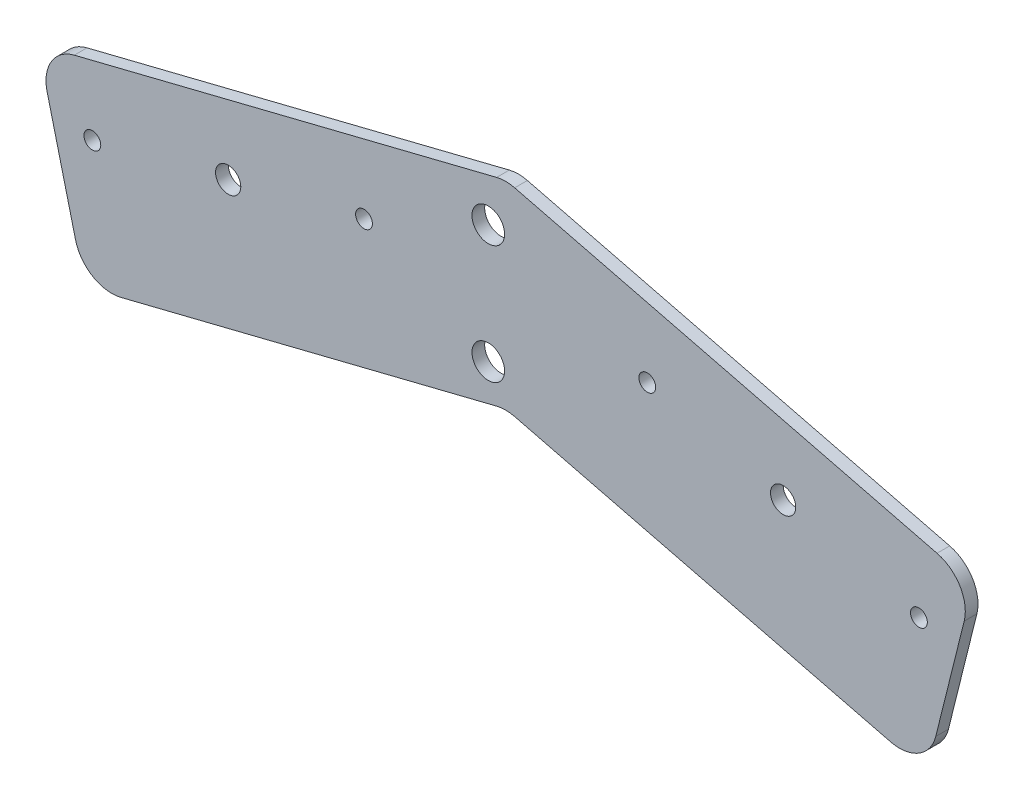
ISO-10303-21;
HEADER;
FILE_DESCRIPTION(('STEP AP214'),'2;1');
FILE_NAME('part.step','',(''),(''),'','','');
FILE_SCHEMA(('AUTOMOTIVE_DESIGN { 1 0 10303 214 1 1 1 1 }'));
ENDSEC;
DATA;
#1=APPLICATION_CONTEXT('core data for automotive mechanical design processes');
#2=APPLICATION_PROTOCOL_DEFINITION('international standard','automotive_design',2000,#1);
#3=PRODUCT_CONTEXT('',#1,'mechanical');
#4=PRODUCT('Part','Part','',(#3));
#5=PRODUCT_RELATED_PRODUCT_CATEGORY('part','',(#4));
#6=PRODUCT_DEFINITION_FORMATION('','',#4);
#7=PRODUCT_DEFINITION_CONTEXT('part definition',#1,'design');
#8=PRODUCT_DEFINITION('design','',#6,#7);
#9=PRODUCT_DEFINITION_SHAPE('','',#8);
#10=(LENGTH_UNIT() NAMED_UNIT(*) SI_UNIT(.MILLI.,.METRE.));
#11=(NAMED_UNIT(*) PLANE_ANGLE_UNIT() SI_UNIT($,.RADIAN.));
#12=(NAMED_UNIT(*) SI_UNIT($,.STERADIAN.) SOLID_ANGLE_UNIT());
#13=UNCERTAINTY_MEASURE_WITH_UNIT(LENGTH_MEASURE(1.E-05),#10,'distance_accuracy_value','');
#14=(GEOMETRIC_REPRESENTATION_CONTEXT(3) GLOBAL_UNCERTAINTY_ASSIGNED_CONTEXT((#13)) GLOBAL_UNIT_ASSIGNED_CONTEXT((#10,
#11,#12)) REPRESENTATION_CONTEXT('',''));
#15=CARTESIAN_POINT('',(0.,0.,0.));
#16=DIRECTION('',(0.,0.,1.));
#17=DIRECTION('',(1.,0.,0.));
#18=AXIS2_PLACEMENT_3D('',#15,#16,#17);
#19=CARTESIAN_POINT('',(0.,-26.5383009557598,-3.4036));
#20=DIRECTION('',(0.,0.,-1.));
#21=DIRECTION('',(-1.,0.,0.));
#22=AXIS2_PLACEMENT_3D('',#19,#20,#21);
#23=PLANE('',#22);
#24=CARTESIAN_POINT('',(-4.64819999999999,-60.7015602345622,-3.4036));
#25=DIRECTION('',(0.,0.,1.));
#26=DIRECTION('',(1.,0.,0.));
#27=AXIS2_PLACEMENT_3D('',#24,#25,#26);
#28=CIRCLE('',#27,4.3688);
#29=CARTESIAN_POINT('',(-0.279399999999996,-60.7015602345622,-3.4036));
#30=VERTEX_POINT('',#29);
#31=EDGE_CURVE('E484',#30,#30,#28,.T.);
#32=ORIENTED_EDGE('',*,*,#31,.T.);
#33=EDGE_LOOP('',(#32));
#34=FACE_BOUND('',#33,.T.);
#35=CARTESIAN_POINT('',(-4.6482,-28.9515602345621,-3.4036));
#36=DIRECTION('',(0.,0.,1.));
#37=DIRECTION('',(1.,0.,0.));
#38=AXIS2_PLACEMENT_3D('',#35,#36,#37);
#39=CIRCLE('',#38,4.3688);
#40=CARTESIAN_POINT('',(-0.279400000000001,-28.9515602345621,-3.4036));
#41=VERTEX_POINT('',#40);
#42=EDGE_CURVE('E492',#41,#41,#39,.T.);
#43=ORIENTED_EDGE('',*,*,#42,.T.);
#44=EDGE_LOOP('',(#43));
#45=FACE_BOUND('',#44,.T.);
#46=CARTESIAN_POINT('',(-110.721225758861,-62.3891120813645,-3.4036));
#47=DIRECTION('',(0.,0.,1.));
#48=DIRECTION('',(1.,0.,0.));
#49=AXIS2_PLACEMENT_3D('',#46,#47,#48);
#50=CIRCLE('',#49,2.25);
#51=CARTESIAN_POINT('',(-108.471225758861,-62.3891120813645,-3.4036));
#52=VERTEX_POINT('',#51);
#53=EDGE_CURVE('E498',#52,#52,#50,.T.);
#54=ORIENTED_EDGE('',*,*,#53,.T.);
#55=EDGE_LOOP('',(#54));
#56=FACE_BOUND('',#55,.T.);
#57=CARTESIAN_POINT('',(-37.9490462881614,-44.2449699113896,-3.4036));
#58=DIRECTION('',(0.,0.,1.));
#59=DIRECTION('',(1.,0.,0.));
#60=AXIS2_PLACEMENT_3D('',#57,#58,#59);
#61=CIRCLE('',#60,2.25);
#62=CARTESIAN_POINT('',(-35.6990462881614,-44.2449699113896,-3.4036));
#63=VERTEX_POINT('',#62);
#64=EDGE_CURVE('E504',#63,#63,#61,.T.);
#65=ORIENTED_EDGE('',*,*,#64,.T.);
#66=EDGE_LOOP('',(#65));
#67=FACE_BOUND('',#66,.T.);
#68=CARTESIAN_POINT('',(37.9490462881613,-44.2449699113896,-3.4036));
#69=DIRECTION('',(0.,0.,1.));
#70=DIRECTION('',(1.,0.,0.));
#71=AXIS2_PLACEMENT_3D('',#68,#69,#70);
#72=CIRCLE('',#71,2.25);
#73=CARTESIAN_POINT('',(40.1990462881613,-44.2449699113896,-3.4036));
#74=VERTEX_POINT('',#73);
#75=EDGE_CURVE('E510',#74,#74,#72,.T.);
#76=ORIENTED_EDGE('',*,*,#75,.T.);
#77=EDGE_LOOP('',(#76));
#78=FACE_BOUND('',#77,.T.);
#79=CARTESIAN_POINT('',(110.721225758861,-62.3891120813644,-3.4036));
#80=DIRECTION('',(0.,0.,1.));
#81=DIRECTION('',(1.,0.,0.));
#82=AXIS2_PLACEMENT_3D('',#79,#80,#81);
#83=CIRCLE('',#82,2.25);
#84=CARTESIAN_POINT('',(112.971225758861,-62.3891120813644,-3.4036));
#85=VERTEX_POINT('',#84);
#86=EDGE_CURVE('E516',#85,#85,#83,.T.);
#87=ORIENTED_EDGE('',*,*,#86,.T.);
#88=EDGE_LOOP('',(#87));
#89=FACE_BOUND('',#88,.T.);
#90=CARTESIAN_POINT('',(-74.3351360235113,-53.317040996377,-3.4036));
#91=DIRECTION('',(0.,0.,1.));
#92=DIRECTION('',(1.,0.,0.));
#93=AXIS2_PLACEMENT_3D('',#90,#91,#92);
#94=CIRCLE('',#93,3.3782);
#95=CARTESIAN_POINT('',(-70.9569360235113,-53.317040996377,-3.4036));
#96=VERTEX_POINT('',#95);
#97=EDGE_CURVE('E305',#96,#96,#94,.T.);
#98=ORIENTED_EDGE('',*,*,#97,.T.);
#99=EDGE_LOOP('',(#98));
#100=FACE_BOUND('',#99,.T.);
#101=CARTESIAN_POINT('',(0.,-26.5383009557598,-3.4036));
#102=DIRECTION('',(0.,0.,1.));
#103=DIRECTION('',(-1.,0.,0.));
#104=AXIS2_PLACEMENT_3D('',#101,#102,#103);
#105=CIRCLE('',#104,10.);
#106=CARTESIAN_POINT('',(2.41921895599665,-16.8353436929998,-3.4036));
#107=VERTEX_POINT('',#106);
#108=CARTESIAN_POINT('',(-2.41921895599665,-16.8353436929998,-3.4036));
#109=VERTEX_POINT('',#108);
#110=EDGE_CURVE('E214',#107,#109,#105,.T.);
#111=ORIENTED_EDGE('',*,*,#110,.F.);
#112=DIRECTION('',(-0.970295726275997,0.241921895599665,0.));
#113=VECTOR('',#112,1.);
#114=CARTESIAN_POINT('',(2.41921895599665,-16.8353436929998,-3.4036));
#115=LINE('',#114,#113);
#116=CARTESIAN_POINT('',(115.560967742793,-45.0447499561963,-3.4036));
#117=VERTEX_POINT('',#116);
#118=EDGE_CURVE('E155',#117,#107,#115,.T.);
#119=ORIENTED_EDGE('',*,*,#118,.F.);
#120=CARTESIAN_POINT('',(113.141748786796,-54.7477072189563,-3.4036));
#121=DIRECTION('',(0.,0.,1.));
#122=DIRECTION('',(-1.,0.,0.));
#123=AXIS2_PLACEMENT_3D('',#120,#121,#122);
#124=CIRCLE('',#123,10.);
#125=CARTESIAN_POINT('',(122.844706049556,-57.1669261749529,-3.4036));
#126=VERTEX_POINT('',#125);
#127=EDGE_CURVE('E139',#126,#117,#124,.T.);
#128=ORIENTED_EDGE('',*,*,#127,.F.);
#129=DIRECTION('',(0.241921895599664,0.970295726275997,0.));
#130=VECTOR('',#129,1.);
#131=CARTESIAN_POINT('',(122.844706049556,-57.1669261749529,-3.4036));
#132=LINE('',#131,#130);
#133=CARTESIAN_POINT('',(115.224166338167,-87.7312415526469,-3.4036));
#134=VERTEX_POINT('',#133);
#135=EDGE_CURVE('E153',#134,#126,#132,.T.);
#136=ORIENTED_EDGE('',*,*,#135,.F.);
#137=CARTESIAN_POINT('',(105.521209075407,-85.3120225966502,-3.4036));
#138=DIRECTION('',(0.,0.,1.));
#139=DIRECTION('',(-1.,0.,0.));
#140=AXIS2_PLACEMENT_3D('',#137,#138,#139);
#141=CIRCLE('',#140,10.);
#142=CARTESIAN_POINT('',(103.10199011941,-95.0149798594102,-3.4036));
#143=VERTEX_POINT('',#142);
#144=EDGE_CURVE('E160',#143,#134,#141,.T.);
#145=ORIENTED_EDGE('',*,*,#144,.F.);
#146=DIRECTION('',(0.970295726275997,-0.241921895599665,0.));
#147=VECTOR('',#146,1.);
#148=CARTESIAN_POINT('',(103.10199011941,-95.0149798594102,-3.4036));
#149=LINE('',#148,#147);
#150=CARTESIAN_POINT('',(2.41921895599663,-69.9119456045196,-3.4036));
#151=VERTEX_POINT('',#150);
#152=EDGE_CURVE('E163',#151,#143,#149,.T.);
#153=ORIENTED_EDGE('',*,*,#152,.F.);
#154=CARTESIAN_POINT('',(0.,-79.6149028672795,-3.4036));
#155=DIRECTION('',(0.,0.,-1.));
#156=DIRECTION('',(1.,0.,0.));
#157=AXIS2_PLACEMENT_3D('',#154,#155,#156);
#158=CIRCLE('',#157,10.);
#159=CARTESIAN_POINT('',(-2.41921895599666,-69.9119456045196,-3.4036));
#160=VERTEX_POINT('',#159);
#161=EDGE_CURVE('E336',#160,#151,#158,.T.);
#162=ORIENTED_EDGE('',*,*,#161,.F.);
#163=DIRECTION('',(0.970295726275997,0.241921895599665,0.));
#164=VECTOR('',#163,1.);
#165=CARTESIAN_POINT('',(-2.41921895599666,-69.9119456045196,-3.4036));
#166=LINE('',#165,#164);
#167=CARTESIAN_POINT('',(-103.10199011941,-95.0149798594102,-3.4036));
#168=VERTEX_POINT('',#167);
#169=EDGE_CURVE('E332',#168,#160,#166,.T.);
#170=ORIENTED_EDGE('',*,*,#169,.F.);
#171=CARTESIAN_POINT('',(-105.521209075407,-85.3120225966503,-3.4036));
#172=DIRECTION('',(0.,0.,1.));
#173=DIRECTION('',(-1.,0.,0.));
#174=AXIS2_PLACEMENT_3D('',#171,#172,#173);
#175=CIRCLE('',#174,9.99999999999999);
#176=CARTESIAN_POINT('',(-115.224166338167,-87.7312415526469,-3.4036));
#177=VERTEX_POINT('',#176);
#178=EDGE_CURVE('E328',#177,#168,#175,.T.);
#179=ORIENTED_EDGE('',*,*,#178,.F.);
#180=DIRECTION('',(0.241921895599665,-0.970295726275997,0.));
#181=VECTOR('',#180,1.);
#182=CARTESIAN_POINT('',(-115.224166338167,-87.7312415526469,-3.4036));
#183=LINE('',#182,#181);
#184=CARTESIAN_POINT('',(-122.844706049556,-57.166926174953,-3.4036));
#185=VERTEX_POINT('',#184);
#186=EDGE_CURVE('E324',#185,#177,#183,.T.);
#187=ORIENTED_EDGE('',*,*,#186,.F.);
#188=CARTESIAN_POINT('',(-113.141748786797,-54.7477072189564,-3.4036));
#189=DIRECTION('',(0.,0.,1.));
#190=DIRECTION('',(1.,0.,0.));
#191=AXIS2_PLACEMENT_3D('',#188,#189,#190);
#192=CIRCLE('',#191,10.);
#193=CARTESIAN_POINT('',(-115.560967742793,-45.0447499561964,-3.4036));
#194=VERTEX_POINT('',#193);
#195=EDGE_CURVE('E320',#194,#185,#192,.T.);
#196=ORIENTED_EDGE('',*,*,#195,.F.);
#197=DIRECTION('',(-0.970295726275997,-0.241921895599665,0.));
#198=VECTOR('',#197,1.);
#199=CARTESIAN_POINT('',(-115.560967742793,-45.0447499561964,-3.4036));
#200=LINE('',#199,#198);
#201=EDGE_CURVE('E317',#109,#194,#200,.T.);
#202=ORIENTED_EDGE('',*,*,#201,.F.);
#203=EDGE_LOOP('',(#111,#119,#128,#136,#145,#153,#162,#170,#179,#187,#196,#202));
#204=FACE_BOUND('',#203,.T.);
#205=CARTESIAN_POINT('',(74.3351360235112,-53.317040996377,-3.4036));
#206=DIRECTION('',(0.,0.,1.));
#207=DIRECTION('',(1.,0.,0.));
#208=AXIS2_PLACEMENT_3D('',#205,#206,#207);
#209=CIRCLE('',#208,3.3782);
#210=CARTESIAN_POINT('',(77.7133360235112,-53.317040996377,-3.4036));
#211=VERTEX_POINT('',#210);
#212=EDGE_CURVE('E174',#211,#211,#209,.T.);
#213=ORIENTED_EDGE('',*,*,#212,.T.);
#214=EDGE_LOOP('',(#213));
#215=FACE_BOUND('',#214,.T.);
#216=ADVANCED_FACE('F41',(#34,#45,#56,#67,#78,#89,#100,#204,#215),#23,.T.);
#217=CARTESIAN_POINT('',(0.,-26.5383009557598,-3.4036));
#218=DIRECTION('',(0.,0.,1.));
#219=DIRECTION('',(1.,0.,0.));
#220=AXIS2_PLACEMENT_3D('',#217,#218,#219);
#221=CYLINDRICAL_SURFACE('',#220,10.);
#222=CARTESIAN_POINT('',(0.,-26.5383009557598,0.));
#223=DIRECTION('',(0.,0.,1.));
#224=DIRECTION('',(-1.,0.,0.));
#225=AXIS2_PLACEMENT_3D('',#222,#223,#224);
#226=CIRCLE('',#225,10.);
#227=CARTESIAN_POINT('',(2.41921895599665,-16.8353436929998,0.));
#228=VERTEX_POINT('',#227);
#229=CARTESIAN_POINT('',(-2.41921895599665,-16.8353436929998,0.));
#230=VERTEX_POINT('',#229);
#231=EDGE_CURVE('E169',#228,#230,#226,.T.);
#232=ORIENTED_EDGE('',*,*,#231,.F.);
#233=DIRECTION('',(0.,0.,1.));
#234=VECTOR('',#233,1.);
#235=CARTESIAN_POINT('',(2.41921895599665,-16.8353436929998,-3.4036));
#236=LINE('',#235,#234);
#237=EDGE_CURVE('E11',#107,#228,#236,.T.);
#238=ORIENTED_EDGE('',*,*,#237,.F.);
#239=ORIENTED_EDGE('',*,*,#110,.T.);
#240=DIRECTION('',(0.,0.,1.));
#241=VECTOR('',#240,1.);
#242=CARTESIAN_POINT('',(-2.41921895599665,-16.8353436929998,-3.4036));
#243=LINE('',#242,#241);
#244=EDGE_CURVE('E45',#109,#230,#243,.T.);
#245=ORIENTED_EDGE('',*,*,#244,.T.);
#246=EDGE_LOOP('',(#232,#238,#239,#245));
#247=FACE_BOUND('',#246,.T.);
#248=ADVANCED_FACE('F43',(#247),#221,.T.);
#249=CARTESIAN_POINT('',(2.41921895599665,-16.8353436929998,-3.4036));
#250=DIRECTION('',(0.241921895599665,0.970295726275997,0.));
#251=DIRECTION('',(-0.970295726275997,0.241921895599665,0.));
#252=AXIS2_PLACEMENT_3D('',#249,#250,#251);
#253=PLANE('',#252);
#254=DIRECTION('',(-0.970295726275997,0.241921895599665,0.));
#255=VECTOR('',#254,1.);
#256=CARTESIAN_POINT('',(2.41921895599665,-16.8353436929998,0.));
#257=LINE('',#256,#255);
#258=CARTESIAN_POINT('',(115.560967742793,-45.0447499561963,0.));
#259=VERTEX_POINT('',#258);
#260=EDGE_CURVE('E211',#259,#228,#257,.T.);
#261=ORIENTED_EDGE('',*,*,#260,.F.);
#262=DIRECTION('',(0.,0.,1.));
#263=VECTOR('',#262,1.);
#264=CARTESIAN_POINT('',(115.560967742793,-45.0447499561963,-3.4036));
#265=LINE('',#264,#263);
#266=EDGE_CURVE('E52',#117,#259,#265,.T.);
#267=ORIENTED_EDGE('',*,*,#266,.F.);
#268=ORIENTED_EDGE('',*,*,#118,.T.);
#269=ORIENTED_EDGE('',*,*,#237,.T.);
#270=EDGE_LOOP('',(#261,#267,#268,#269));
#271=FACE_BOUND('',#270,.T.);
#272=ADVANCED_FACE('F244',(#271),#253,.T.);
#273=CARTESIAN_POINT('',(113.141748786796,-54.7477072189563,-3.4036));
#274=DIRECTION('',(0.,0.,1.));
#275=DIRECTION('',(1.,0.,0.));
#276=AXIS2_PLACEMENT_3D('',#273,#274,#275);
#277=CYLINDRICAL_SURFACE('',#276,10.);
#278=CARTESIAN_POINT('',(113.141748786796,-54.7477072189563,0.));
#279=DIRECTION('',(0.,0.,1.));
#280=DIRECTION('',(-1.,0.,0.));
#281=AXIS2_PLACEMENT_3D('',#278,#279,#280);
#282=CIRCLE('',#281,10.);
#283=CARTESIAN_POINT('',(122.844706049556,-57.1669261749529,0.));
#284=VERTEX_POINT('',#283);
#285=EDGE_CURVE('E141',#284,#259,#282,.T.);
#286=ORIENTED_EDGE('',*,*,#285,.F.);
#287=DIRECTION('',(0.,0.,1.));
#288=VECTOR('',#287,1.);
#289=CARTESIAN_POINT('',(122.844706049556,-57.1669261749529,-3.4036));
#290=LINE('',#289,#288);
#291=EDGE_CURVE('E136',#126,#284,#290,.T.);
#292=ORIENTED_EDGE('',*,*,#291,.F.);
#293=ORIENTED_EDGE('',*,*,#127,.T.);
#294=ORIENTED_EDGE('',*,*,#266,.T.);
#295=EDGE_LOOP('',(#286,#292,#293,#294));
#296=FACE_BOUND('',#295,.T.);
#297=ADVANCED_FACE('F138',(#296),#277,.T.);
#298=CARTESIAN_POINT('',(122.844706049556,-57.1669261749529,-3.4036));
#299=DIRECTION('',(0.970295726275997,-0.241921895599664,0.));
#300=DIRECTION('',(0.241921895599664,0.970295726275997,0.));
#301=AXIS2_PLACEMENT_3D('',#298,#299,#300);
#302=PLANE('',#301);
#303=DIRECTION('',(0.241921895599664,0.970295726275997,0.));
#304=VECTOR('',#303,1.);
#305=CARTESIAN_POINT('',(122.844706049556,-57.1669261749529,0.));
#306=LINE('',#305,#304);
#307=CARTESIAN_POINT('',(115.224166338167,-87.7312415526469,0.));
#308=VERTEX_POINT('',#307);
#309=EDGE_CURVE('E206',#308,#284,#306,.T.);
#310=ORIENTED_EDGE('',*,*,#309,.F.);
#311=DIRECTION('',(0.,0.,1.));
#312=VECTOR('',#311,1.);
#313=CARTESIAN_POINT('',(115.224166338167,-87.7312415526469,-3.4036));
#314=LINE('',#313,#312);
#315=EDGE_CURVE('E147',#134,#308,#314,.T.);
#316=ORIENTED_EDGE('',*,*,#315,.F.);
#317=ORIENTED_EDGE('',*,*,#135,.T.);
#318=ORIENTED_EDGE('',*,*,#291,.T.);
#319=EDGE_LOOP('',(#310,#316,#317,#318));
#320=FACE_BOUND('',#319,.T.);
#321=ADVANCED_FACE('F158',(#320),#302,.T.);
#322=CARTESIAN_POINT('',(105.521209075407,-85.3120225966502,-3.4036));
#323=DIRECTION('',(0.,0.,1.));
#324=DIRECTION('',(1.,0.,0.));
#325=AXIS2_PLACEMENT_3D('',#322,#323,#324);
#326=CYLINDRICAL_SURFACE('',#325,10.);
#327=CARTESIAN_POINT('',(105.521209075407,-85.3120225966502,0.));
#328=DIRECTION('',(0.,0.,1.));
#329=DIRECTION('',(-1.,0.,0.));
#330=AXIS2_PLACEMENT_3D('',#327,#328,#329);
#331=CIRCLE('',#330,10.);
#332=CARTESIAN_POINT('',(103.10199011941,-95.0149798594102,0.));
#333=VERTEX_POINT('',#332);
#334=EDGE_CURVE('E202',#333,#308,#331,.T.);
#335=ORIENTED_EDGE('',*,*,#334,.F.);
#336=DIRECTION('',(0.,0.,1.));
#337=VECTOR('',#336,1.);
#338=CARTESIAN_POINT('',(103.10199011941,-95.0149798594102,-3.4036));
#339=LINE('',#338,#337);
#340=EDGE_CURVE('E220',#143,#333,#339,.T.);
#341=ORIENTED_EDGE('',*,*,#340,.F.);
#342=ORIENTED_EDGE('',*,*,#144,.T.);
#343=ORIENTED_EDGE('',*,*,#315,.T.);
#344=EDGE_LOOP('',(#335,#341,#342,#343));
#345=FACE_BOUND('',#344,.T.);
#346=ADVANCED_FACE('F365',(#345),#326,.T.);
#347=CARTESIAN_POINT('',(103.10199011941,-95.0149798594102,-3.4036));
#348=DIRECTION('',(-0.241921895599665,-0.970295726275997,0.));
#349=DIRECTION('',(0.970295726275997,-0.241921895599665,0.));
#350=AXIS2_PLACEMENT_3D('',#347,#348,#349);
#351=PLANE('',#350);
#352=DIRECTION('',(0.970295726275997,-0.241921895599665,0.));
#353=VECTOR('',#352,1.);
#354=CARTESIAN_POINT('',(103.10199011941,-95.0149798594102,0.));
#355=LINE('',#354,#353);
#356=CARTESIAN_POINT('',(2.41921895599663,-69.9119456045196,0.));
#357=VERTEX_POINT('',#356);
#358=EDGE_CURVE('E198',#357,#333,#355,.T.);
#359=ORIENTED_EDGE('',*,*,#358,.F.);
#360=DIRECTION('',(0.,0.,1.));
#361=VECTOR('',#360,1.);
#362=CARTESIAN_POINT('',(2.41921895599663,-69.9119456045196,-3.4036));
#363=LINE('',#362,#361);
#364=EDGE_CURVE('E223',#151,#357,#363,.T.);
#365=ORIENTED_EDGE('',*,*,#364,.F.);
#366=ORIENTED_EDGE('',*,*,#152,.T.);
#367=ORIENTED_EDGE('',*,*,#340,.T.);
#368=EDGE_LOOP('',(#359,#365,#366,#367));
#369=FACE_BOUND('',#368,.T.);
#370=ADVANCED_FACE('F344',(#369),#351,.T.);
#371=CARTESIAN_POINT('',(0.,-79.6149028672795,-3.4036));
#372=DIRECTION('',(0.,0.,1.));
#373=DIRECTION('',(1.,0.,0.));
#374=AXIS2_PLACEMENT_3D('',#371,#372,#373);
#375=CYLINDRICAL_SURFACE('',#374,10.);
#376=CARTESIAN_POINT('',(0.,-79.6149028672795,0.));
#377=DIRECTION('',(0.,0.,-1.));
#378=DIRECTION('',(1.,0.,0.));
#379=AXIS2_PLACEMENT_3D('',#376,#377,#378);
#380=CIRCLE('',#379,10.);
#381=CARTESIAN_POINT('',(-2.41921895599666,-69.9119456045196,0.));
#382=VERTEX_POINT('',#381);
#383=EDGE_CURVE('E194',#382,#357,#380,.T.);
#384=ORIENTED_EDGE('',*,*,#383,.F.);
#385=DIRECTION('',(0.,0.,1.));
#386=VECTOR('',#385,1.);
#387=CARTESIAN_POINT('',(-2.41921895599666,-69.9119456045196,-3.4036));
#388=LINE('',#387,#386);
#389=EDGE_CURVE('E226',#160,#382,#388,.T.);
#390=ORIENTED_EDGE('',*,*,#389,.F.);
#391=ORIENTED_EDGE('',*,*,#161,.T.);
#392=ORIENTED_EDGE('',*,*,#364,.T.);
#393=EDGE_LOOP('',(#384,#390,#391,#392));
#394=FACE_BOUND('',#393,.T.);
#395=ADVANCED_FACE('F350',(#394),#375,.F.);
#396=CARTESIAN_POINT('',(-2.41921895599666,-69.9119456045196,-3.4036));
#397=DIRECTION('',(0.241921895599665,-0.970295726275997,0.));
#398=DIRECTION('',(0.970295726275997,0.241921895599665,0.));
#399=AXIS2_PLACEMENT_3D('',#396,#397,#398);
#400=PLANE('',#399);
#401=DIRECTION('',(0.970295726275997,0.241921895599665,0.));
#402=VECTOR('',#401,1.);
#403=CARTESIAN_POINT('',(-2.41921895599666,-69.9119456045196,0.));
#404=LINE('',#403,#402);
#405=CARTESIAN_POINT('',(-103.10199011941,-95.0149798594102,0.));
#406=VERTEX_POINT('',#405);
#407=EDGE_CURVE('E190',#406,#382,#404,.T.);
#408=ORIENTED_EDGE('',*,*,#407,.F.);
#409=DIRECTION('',(0.,0.,1.));
#410=VECTOR('',#409,1.);
#411=CARTESIAN_POINT('',(-103.10199011941,-95.0149798594102,-3.4036));
#412=LINE('',#411,#410);
#413=EDGE_CURVE('E229',#168,#406,#412,.T.);
#414=ORIENTED_EDGE('',*,*,#413,.F.);
#415=ORIENTED_EDGE('',*,*,#169,.T.);
#416=ORIENTED_EDGE('',*,*,#389,.T.);
#417=EDGE_LOOP('',(#408,#414,#415,#416));
#418=FACE_BOUND('',#417,.T.);
#419=ADVANCED_FACE('F353',(#418),#400,.T.);
#420=CARTESIAN_POINT('',(-105.521209075407,-85.3120225966503,-3.4036));
#421=DIRECTION('',(0.,0.,1.));
#422=DIRECTION('',(1.,0.,0.));
#423=AXIS2_PLACEMENT_3D('',#420,#421,#422);
#424=CYLINDRICAL_SURFACE('',#423,9.99999999999999);
#425=CARTESIAN_POINT('',(-105.521209075407,-85.3120225966503,0.));
#426=DIRECTION('',(0.,0.,1.));
#427=DIRECTION('',(-1.,0.,0.));
#428=AXIS2_PLACEMENT_3D('',#425,#426,#427);
#429=CIRCLE('',#428,9.99999999999999);
#430=CARTESIAN_POINT('',(-115.224166338167,-87.7312415526469,0.));
#431=VERTEX_POINT('',#430);
#432=EDGE_CURVE('E186',#431,#406,#429,.T.);
#433=ORIENTED_EDGE('',*,*,#432,.F.);
#434=DIRECTION('',(0.,0.,1.));
#435=VECTOR('',#434,1.);
#436=CARTESIAN_POINT('',(-115.224166338167,-87.7312415526469,-3.4036));
#437=LINE('',#436,#435);
#438=EDGE_CURVE('E232',#177,#431,#437,.T.);
#439=ORIENTED_EDGE('',*,*,#438,.F.);
#440=ORIENTED_EDGE('',*,*,#178,.T.);
#441=ORIENTED_EDGE('',*,*,#413,.T.);
#442=EDGE_LOOP('',(#433,#439,#440,#441));
#443=FACE_BOUND('',#442,.T.);
#444=ADVANCED_FACE('F358',(#443),#424,.T.);
#445=CARTESIAN_POINT('',(-115.224166338167,-87.7312415526469,-3.4036));
#446=DIRECTION('',(-0.970295726275997,-0.241921895599665,0.));
#447=DIRECTION('',(0.241921895599665,-0.970295726275997,0.));
#448=AXIS2_PLACEMENT_3D('',#445,#446,#447);
#449=PLANE('',#448);
#450=DIRECTION('',(0.241921895599665,-0.970295726275997,0.));
#451=VECTOR('',#450,1.);
#452=CARTESIAN_POINT('',(-115.224166338167,-87.7312415526469,0.));
#453=LINE('',#452,#451);
#454=CARTESIAN_POINT('',(-122.844706049556,-57.166926174953,0.));
#455=VERTEX_POINT('',#454);
#456=EDGE_CURVE('E182',#455,#431,#453,.T.);
#457=ORIENTED_EDGE('',*,*,#456,.F.);
#458=DIRECTION('',(0.,0.,1.));
#459=VECTOR('',#458,1.);
#460=CARTESIAN_POINT('',(-122.844706049556,-57.166926174953,-3.4036));
#461=LINE('',#460,#459);
#462=EDGE_CURVE('E235',#185,#455,#461,.T.);
#463=ORIENTED_EDGE('',*,*,#462,.F.);
#464=ORIENTED_EDGE('',*,*,#186,.T.);
#465=ORIENTED_EDGE('',*,*,#438,.T.);
#466=EDGE_LOOP('',(#457,#463,#464,#465));
#467=FACE_BOUND('',#466,.T.);
#468=ADVANCED_FACE('F361',(#467),#449,.T.);
#469=CARTESIAN_POINT('',(-113.141748786797,-54.7477072189564,-3.4036));
#470=DIRECTION('',(0.,0.,1.));
#471=DIRECTION('',(1.,0.,0.));
#472=AXIS2_PLACEMENT_3D('',#469,#470,#471);
#473=CYLINDRICAL_SURFACE('',#472,10.);
#474=CARTESIAN_POINT('',(-113.141748786797,-54.7477072189564,0.));
#475=DIRECTION('',(0.,0.,1.));
#476=DIRECTION('',(1.,0.,0.));
#477=AXIS2_PLACEMENT_3D('',#474,#475,#476);
#478=CIRCLE('',#477,10.);
#479=CARTESIAN_POINT('',(-115.560967742793,-45.0447499561964,0.));
#480=VERTEX_POINT('',#479);
#481=EDGE_CURVE('E178',#480,#455,#478,.T.);
#482=ORIENTED_EDGE('',*,*,#481,.F.);
#483=DIRECTION('',(0.,0.,1.));
#484=VECTOR('',#483,1.);
#485=CARTESIAN_POINT('',(-115.560967742793,-45.0447499561964,-3.4036));
#486=LINE('',#485,#484);
#487=EDGE_CURVE('E237',#194,#480,#486,.T.);
#488=ORIENTED_EDGE('',*,*,#487,.F.);
#489=ORIENTED_EDGE('',*,*,#195,.T.);
#490=ORIENTED_EDGE('',*,*,#462,.T.);
#491=EDGE_LOOP('',(#482,#488,#489,#490));
#492=FACE_BOUND('',#491,.T.);
#493=ADVANCED_FACE('F271',(#492),#473,.T.);
#494=CARTESIAN_POINT('',(-115.560967742793,-45.0447499561964,-3.4036));
#495=DIRECTION('',(-0.241921895599665,0.970295726275997,0.));
#496=DIRECTION('',(-0.970295726275997,-0.241921895599665,0.));
#497=AXIS2_PLACEMENT_3D('',#494,#495,#496);
#498=PLANE('',#497);
#499=DIRECTION('',(-0.970295726275997,-0.241921895599665,0.));
#500=VECTOR('',#499,1.);
#501=CARTESIAN_POINT('',(-115.560967742793,-45.0447499561964,0.));
#502=LINE('',#501,#500);
#503=EDGE_CURVE('E173',#230,#480,#502,.T.);
#504=ORIENTED_EDGE('',*,*,#503,.F.);
#505=ORIENTED_EDGE('',*,*,#244,.F.);
#506=ORIENTED_EDGE('',*,*,#201,.T.);
#507=ORIENTED_EDGE('',*,*,#487,.T.);
#508=EDGE_LOOP('',(#504,#505,#506,#507));
#509=FACE_BOUND('',#508,.T.);
#510=ADVANCED_FACE('F241',(#509),#498,.T.);
#511=CARTESIAN_POINT('',(0.,-26.5383009557598,0.));
#512=DIRECTION('',(0.,0.,-1.));
#513=DIRECTION('',(-1.,0.,0.));
#514=AXIS2_PLACEMENT_3D('',#511,#512,#513);
#515=PLANE('',#514);
#516=CARTESIAN_POINT('',(-4.64819999999999,-60.7015602345622,0.));
#517=DIRECTION('',(0.,0.,1.));
#518=DIRECTION('',(1.,0.,0.));
#519=AXIS2_PLACEMENT_3D('',#516,#517,#518);
#520=CIRCLE('',#519,4.3688);
#521=CARTESIAN_POINT('',(-0.279399999999996,-60.7015602345622,0.));
#522=VERTEX_POINT('',#521);
#523=EDGE_CURVE('E275',#522,#522,#520,.T.);
#524=ORIENTED_EDGE('',*,*,#523,.F.);
#525=EDGE_LOOP('',(#524));
#526=FACE_BOUND('',#525,.T.);
#527=CARTESIAN_POINT('',(-4.6482,-28.9515602345621,0.));
#528=DIRECTION('',(0.,0.,1.));
#529=DIRECTION('',(1.,0.,0.));
#530=AXIS2_PLACEMENT_3D('',#527,#528,#529);
#531=CIRCLE('',#530,4.3688);
#532=CARTESIAN_POINT('',(-0.2794,-28.9515602345621,0.));
#533=VERTEX_POINT('',#532);
#534=EDGE_CURVE('E279',#533,#533,#531,.T.);
#535=ORIENTED_EDGE('',*,*,#534,.F.);
#536=EDGE_LOOP('',(#535));
#537=FACE_BOUND('',#536,.T.);
#538=CARTESIAN_POINT('',(-110.721225758861,-62.3891120813645,0.));
#539=DIRECTION('',(0.,0.,1.));
#540=DIRECTION('',(1.,0.,0.));
#541=AXIS2_PLACEMENT_3D('',#538,#539,#540);
#542=CIRCLE('',#541,2.25);
#543=CARTESIAN_POINT('',(-108.471225758861,-62.3891120813645,0.));
#544=VERTEX_POINT('',#543);
#545=EDGE_CURVE('E283',#544,#544,#542,.T.);
#546=ORIENTED_EDGE('',*,*,#545,.F.);
#547=EDGE_LOOP('',(#546));
#548=FACE_BOUND('',#547,.T.);
#549=CARTESIAN_POINT('',(-37.9490462881614,-44.2449699113896,0.));
#550=DIRECTION('',(0.,0.,1.));
#551=DIRECTION('',(1.,0.,0.));
#552=AXIS2_PLACEMENT_3D('',#549,#550,#551);
#553=CIRCLE('',#552,2.25);
#554=CARTESIAN_POINT('',(-35.6990462881614,-44.2449699113896,0.));
#555=VERTEX_POINT('',#554);
#556=EDGE_CURVE('E287',#555,#555,#553,.T.);
#557=ORIENTED_EDGE('',*,*,#556,.F.);
#558=EDGE_LOOP('',(#557));
#559=FACE_BOUND('',#558,.T.);
#560=CARTESIAN_POINT('',(37.9490462881613,-44.2449699113896,0.));
#561=DIRECTION('',(0.,0.,1.));
#562=DIRECTION('',(1.,0.,0.));
#563=AXIS2_PLACEMENT_3D('',#560,#561,#562);
#564=CIRCLE('',#563,2.25);
#565=CARTESIAN_POINT('',(40.1990462881613,-44.2449699113896,0.));
#566=VERTEX_POINT('',#565);
#567=EDGE_CURVE('E291',#566,#566,#564,.T.);
#568=ORIENTED_EDGE('',*,*,#567,.F.);
#569=EDGE_LOOP('',(#568));
#570=FACE_BOUND('',#569,.T.);
#571=CARTESIAN_POINT('',(110.721225758861,-62.3891120813644,0.));
#572=DIRECTION('',(0.,0.,1.));
#573=DIRECTION('',(1.,0.,0.));
#574=AXIS2_PLACEMENT_3D('',#571,#572,#573);
#575=CIRCLE('',#574,2.25);
#576=CARTESIAN_POINT('',(112.971225758861,-62.3891120813644,0.));
#577=VERTEX_POINT('',#576);
#578=EDGE_CURVE('E295',#577,#577,#575,.T.);
#579=ORIENTED_EDGE('',*,*,#578,.F.);
#580=EDGE_LOOP('',(#579));
#581=FACE_BOUND('',#580,.T.);
#582=CARTESIAN_POINT('',(-74.3351360235113,-53.317040996377,0.));
#583=DIRECTION('',(0.,0.,1.));
#584=DIRECTION('',(1.,0.,0.));
#585=AXIS2_PLACEMENT_3D('',#582,#583,#584);
#586=CIRCLE('',#585,3.3782);
#587=CARTESIAN_POINT('',(-70.9569360235113,-53.317040996377,0.));
#588=VERTEX_POINT('',#587);
#589=EDGE_CURVE('E299',#588,#588,#586,.T.);
#590=ORIENTED_EDGE('',*,*,#589,.F.);
#591=EDGE_LOOP('',(#590));
#592=FACE_BOUND('',#591,.T.);
#593=CARTESIAN_POINT('',(74.3351360235112,-53.317040996377,0.));
#594=DIRECTION('',(0.,0.,1.));
#595=DIRECTION('',(1.,0.,0.));
#596=AXIS2_PLACEMENT_3D('',#593,#594,#595);
#597=CIRCLE('',#596,3.3782);
#598=CARTESIAN_POINT('',(77.7133360235112,-53.317040996377,0.));
#599=VERTEX_POINT('',#598);
#600=EDGE_CURVE('E302',#599,#599,#597,.T.);
#601=ORIENTED_EDGE('',*,*,#600,.F.);
#602=EDGE_LOOP('',(#601));
#603=FACE_BOUND('',#602,.T.);
#604=ORIENTED_EDGE('',*,*,#231,.T.);
#605=ORIENTED_EDGE('',*,*,#503,.T.);
#606=ORIENTED_EDGE('',*,*,#481,.T.);
#607=ORIENTED_EDGE('',*,*,#456,.T.);
#608=ORIENTED_EDGE('',*,*,#432,.T.);
#609=ORIENTED_EDGE('',*,*,#407,.T.);
#610=ORIENTED_EDGE('',*,*,#383,.T.);
#611=ORIENTED_EDGE('',*,*,#358,.T.);
#612=ORIENTED_EDGE('',*,*,#334,.T.);
#613=ORIENTED_EDGE('',*,*,#309,.T.);
#614=ORIENTED_EDGE('',*,*,#285,.T.);
#615=ORIENTED_EDGE('',*,*,#260,.T.);
#616=EDGE_LOOP('',(#604,#605,#606,#607,#608,#609,#610,#611,#612,#613,#614,#615));
#617=FACE_BOUND('',#616,.T.);
#618=ADVANCED_FACE('F243',(#526,#537,#548,#559,#570,#581,#592,#603,#617),#515,.F.);
#619=CARTESIAN_POINT('',(74.3351360235112,-53.317040996377,0.));
#620=DIRECTION('',(0.,0.,1.));
#621=DIRECTION('',(1.,0.,0.));
#622=AXIS2_PLACEMENT_3D('',#619,#620,#621);
#623=CYLINDRICAL_SURFACE('',#622,3.3782);
#624=ORIENTED_EDGE('',*,*,#212,.F.);
#625=EDGE_LOOP('',(#624));
#626=FACE_BOUND('',#625,.T.);
#627=ORIENTED_EDGE('',*,*,#600,.T.);
#628=EDGE_LOOP('',(#627));
#629=FACE_BOUND('',#628,.T.);
#630=ADVANCED_FACE('F261',(#626,#629),#623,.F.);
#631=CARTESIAN_POINT('',(-74.3351360235113,-53.317040996377,0.));
#632=DIRECTION('',(0.,0.,1.));
#633=DIRECTION('',(1.,0.,0.));
#634=AXIS2_PLACEMENT_3D('',#631,#632,#633);
#635=CYLINDRICAL_SURFACE('',#634,3.3782);
#636=ORIENTED_EDGE('',*,*,#97,.F.);
#637=EDGE_LOOP('',(#636));
#638=FACE_BOUND('',#637,.T.);
#639=ORIENTED_EDGE('',*,*,#589,.T.);
#640=EDGE_LOOP('',(#639));
#641=FACE_BOUND('',#640,.T.);
#642=ADVANCED_FACE('F269',(#638,#641),#635,.F.);
#643=CARTESIAN_POINT('',(110.721225758861,-62.3891120813644,0.));
#644=DIRECTION('',(0.,0.,1.));
#645=DIRECTION('',(1.,0.,0.));
#646=AXIS2_PLACEMENT_3D('',#643,#644,#645);
#647=CYLINDRICAL_SURFACE('',#646,2.25);
#648=ORIENTED_EDGE('',*,*,#86,.F.);
#649=EDGE_LOOP('',(#648));
#650=FACE_BOUND('',#649,.T.);
#651=ORIENTED_EDGE('',*,*,#578,.T.);
#652=EDGE_LOOP('',(#651));
#653=FACE_BOUND('',#652,.T.);
#654=ADVANCED_FACE('F409',(#650,#653),#647,.F.);
#655=CARTESIAN_POINT('',(37.9490462881613,-44.2449699113896,0.));
#656=DIRECTION('',(0.,0.,1.));
#657=DIRECTION('',(1.,0.,0.));
#658=AXIS2_PLACEMENT_3D('',#655,#656,#657);
#659=CYLINDRICAL_SURFACE('',#658,2.25);
#660=ORIENTED_EDGE('',*,*,#75,.F.);
#661=EDGE_LOOP('',(#660));
#662=FACE_BOUND('',#661,.T.);
#663=ORIENTED_EDGE('',*,*,#567,.T.);
#664=EDGE_LOOP('',(#663));
#665=FACE_BOUND('',#664,.T.);
#666=ADVANCED_FACE('F418',(#662,#665),#659,.F.);
#667=CARTESIAN_POINT('',(-37.9490462881614,-44.2449699113896,0.));
#668=DIRECTION('',(0.,0.,1.));
#669=DIRECTION('',(1.,0.,0.));
#670=AXIS2_PLACEMENT_3D('',#667,#668,#669);
#671=CYLINDRICAL_SURFACE('',#670,2.25);
#672=ORIENTED_EDGE('',*,*,#64,.F.);
#673=EDGE_LOOP('',(#672));
#674=FACE_BOUND('',#673,.T.);
#675=ORIENTED_EDGE('',*,*,#556,.T.);
#676=EDGE_LOOP('',(#675));
#677=FACE_BOUND('',#676,.T.);
#678=ADVANCED_FACE('F428',(#674,#677),#671,.F.);
#679=CARTESIAN_POINT('',(-110.721225758861,-62.3891120813645,0.));
#680=DIRECTION('',(0.,0.,1.));
#681=DIRECTION('',(1.,0.,0.));
#682=AXIS2_PLACEMENT_3D('',#679,#680,#681);
#683=CYLINDRICAL_SURFACE('',#682,2.25);
#684=ORIENTED_EDGE('',*,*,#53,.F.);
#685=EDGE_LOOP('',(#684));
#686=FACE_BOUND('',#685,.T.);
#687=ORIENTED_EDGE('',*,*,#545,.T.);
#688=EDGE_LOOP('',(#687));
#689=FACE_BOUND('',#688,.T.);
#690=ADVANCED_FACE('F438',(#686,#689),#683,.F.);
#691=CARTESIAN_POINT('',(-4.6482,-28.9515602345621,0.));
#692=DIRECTION('',(0.,0.,1.));
#693=DIRECTION('',(1.,0.,0.));
#694=AXIS2_PLACEMENT_3D('',#691,#692,#693);
#695=CYLINDRICAL_SURFACE('',#694,4.3688);
#696=ORIENTED_EDGE('',*,*,#42,.F.);
#697=EDGE_LOOP('',(#696));
#698=FACE_BOUND('',#697,.T.);
#699=ORIENTED_EDGE('',*,*,#534,.T.);
#700=EDGE_LOOP('',(#699));
#701=FACE_BOUND('',#700,.T.);
#702=ADVANCED_FACE('F447',(#698,#701),#695,.F.);
#703=CARTESIAN_POINT('',(-4.64819999999999,-60.7015602345622,0.));
#704=DIRECTION('',(0.,0.,1.));
#705=DIRECTION('',(1.,0.,0.));
#706=AXIS2_PLACEMENT_3D('',#703,#704,#705);
#707=CYLINDRICAL_SURFACE('',#706,4.3688);
#708=ORIENTED_EDGE('',*,*,#31,.F.);
#709=EDGE_LOOP('',(#708));
#710=FACE_BOUND('',#709,.T.);
#711=ORIENTED_EDGE('',*,*,#523,.T.);
#712=EDGE_LOOP('',(#711));
#713=FACE_BOUND('',#712,.T.);
#714=ADVANCED_FACE('F465',(#710,#713),#707,.F.);
#715=CLOSED_SHELL('',(#216,#248,#272,#297,#321,#346,#370,#395,#419,#444,#468,#493,#510,#618,
#630,#642,#654,#666,#678,#690,#702,#714));
#716=MANIFOLD_SOLID_BREP('B2',#715);
#717=ADVANCED_BREP_SHAPE_REPRESENTATION('',(#18,#716),#14);
#718=SHAPE_DEFINITION_REPRESENTATION(#9,#717);
ENDSEC;
END-ISO-10303-21;
